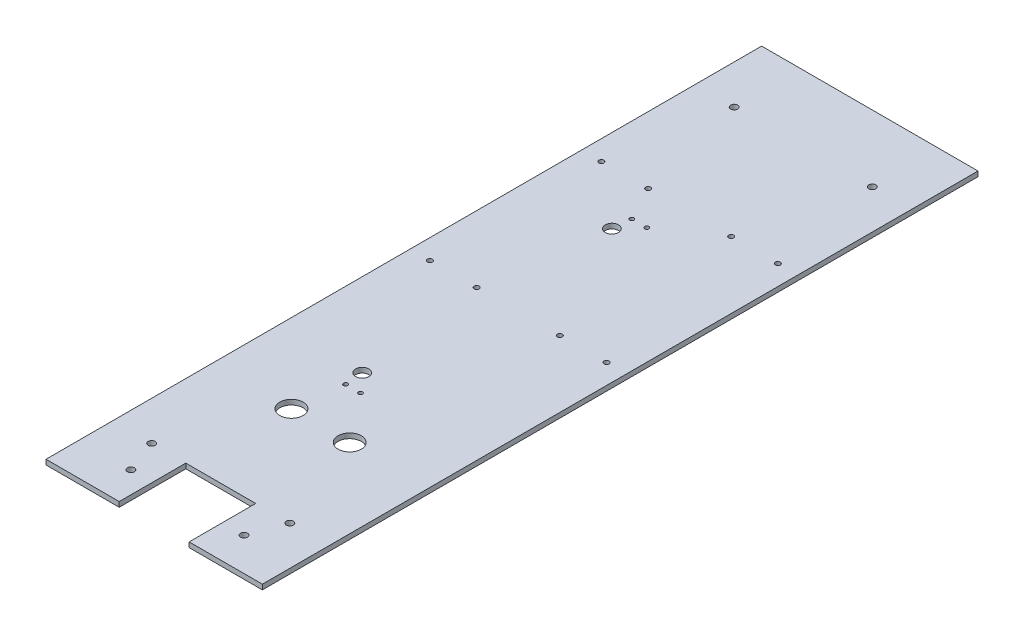
ISO-10303-21;
HEADER;
FILE_DESCRIPTION(('STEP AP214'),'2;1');
FILE_NAME('part.step','',(''),(''),'','','');
FILE_SCHEMA(('AUTOMOTIVE_DESIGN { 1 0 10303 214 1 1 1 1 }'));
ENDSEC;
DATA;
#1=APPLICATION_CONTEXT('core data for automotive mechanical design processes');
#2=APPLICATION_PROTOCOL_DEFINITION('international standard','automotive_design',2000,#1);
#3=PRODUCT_CONTEXT('',#1,'mechanical');
#4=PRODUCT('Part','Part','',(#3));
#5=PRODUCT_RELATED_PRODUCT_CATEGORY('part','',(#4));
#6=PRODUCT_DEFINITION_FORMATION('','',#4);
#7=PRODUCT_DEFINITION_CONTEXT('part definition',#1,'design');
#8=PRODUCT_DEFINITION('design','',#6,#7);
#9=PRODUCT_DEFINITION_SHAPE('','',#8);
#10=(LENGTH_UNIT() NAMED_UNIT(*) SI_UNIT(.MILLI.,.METRE.));
#11=(NAMED_UNIT(*) PLANE_ANGLE_UNIT() SI_UNIT($,.RADIAN.));
#12=(NAMED_UNIT(*) SI_UNIT($,.STERADIAN.) SOLID_ANGLE_UNIT());
#13=UNCERTAINTY_MEASURE_WITH_UNIT(LENGTH_MEASURE(1.E-05),#10,'distance_accuracy_value','');
#14=(GEOMETRIC_REPRESENTATION_CONTEXT(3) GLOBAL_UNCERTAINTY_ASSIGNED_CONTEXT((#13)) GLOBAL_UNIT_ASSIGNED_CONTEXT((#10,
#11,#12)) REPRESENTATION_CONTEXT('',''));
#15=CARTESIAN_POINT('',(0.,0.,0.));
#16=DIRECTION('',(0.,0.,1.));
#17=DIRECTION('',(1.,0.,0.));
#18=AXIS2_PLACEMENT_3D('',#15,#16,#17);
#19=CARTESIAN_POINT('',(-65.,3.,215.));
#20=DIRECTION('',(0.,0.,-1.));
#21=DIRECTION('',(-1.,0.,0.));
#22=AXIS2_PLACEMENT_3D('',#19,#20,#21);
#23=PLANE('',#22);
#24=DIRECTION('',(0.,1.,0.));
#25=VECTOR('',#24,1.);
#26=CARTESIAN_POINT('',(-21.,-7.,215.));
#27=LINE('',#26,#25);
#28=CARTESIAN_POINT('',(-21.,0.,215.));
#29=VERTEX_POINT('',#28);
#30=CARTESIAN_POINT('',(-21.,3.,215.));
#31=VERTEX_POINT('',#30);
#32=EDGE_CURVE('E122',#29,#31,#27,.T.);
#33=ORIENTED_EDGE('',*,*,#32,.T.);
#34=DIRECTION('',(1.,0.,0.));
#35=VECTOR('',#34,1.);
#36=CARTESIAN_POINT('',(-65.,3.,215.));
#37=LINE('',#36,#35);
#38=CARTESIAN_POINT('',(-65.,3.,215.));
#39=VERTEX_POINT('',#38);
#40=EDGE_CURVE('E136',#39,#31,#37,.T.);
#41=ORIENTED_EDGE('',*,*,#40,.F.);
#42=DIRECTION('',(0.,-1.,0.));
#43=VECTOR('',#42,1.);
#44=CARTESIAN_POINT('',(-65.,3.,215.));
#45=LINE('',#44,#43);
#46=CARTESIAN_POINT('',(-65.,0.,215.));
#47=VERTEX_POINT('',#46);
#48=EDGE_CURVE('E147',#39,#47,#45,.T.);
#49=ORIENTED_EDGE('',*,*,#48,.T.);
#50=DIRECTION('',(1.,0.,0.));
#51=VECTOR('',#50,1.);
#52=CARTESIAN_POINT('',(-65.,0.,215.));
#53=LINE('',#52,#51);
#54=EDGE_CURVE('E138',#47,#29,#53,.T.);
#55=ORIENTED_EDGE('',*,*,#54,.T.);
#56=EDGE_LOOP('',(#33,#41,#49,#55));
#57=FACE_BOUND('',#56,.T.);
#58=ADVANCED_FACE('F45',(#57),#23,.F.);
#59=CARTESIAN_POINT('',(0.,3.,0.));
#60=DIRECTION('',(0.,1.,0.));
#61=DIRECTION('',(0.,0.,1.));
#62=AXIS2_PLACEMENT_3D('',#59,#60,#61);
#63=PLANE('',#62);
#64=CARTESIAN_POINT('',(-5.00000000000006,3.,86.0000000000001));
#65=DIRECTION('',(0.,1.,0.));
#66=DIRECTION('',(0.,0.,1.));
#67=AXIS2_PLACEMENT_3D('',#64,#65,#66);
#68=CIRCLE('',#67,1.25);
#69=CARTESIAN_POINT('',(-5.00000000000006,3.,87.2500000000001));
#70=VERTEX_POINT('',#69);
#71=EDGE_CURVE('E316',#70,#70,#68,.T.);
#72=ORIENTED_EDGE('',*,*,#71,.F.);
#73=EDGE_LOOP('',(#72));
#74=FACE_BOUND('',#73,.T.);
#75=CARTESIAN_POINT('',(-14.0000000000001,3.,86.0000000000001));
#76=DIRECTION('',(0.,1.,0.));
#77=DIRECTION('',(0.,0.,1.));
#78=AXIS2_PLACEMENT_3D('',#75,#76,#77);
#79=CIRCLE('',#78,1.25);
#80=CARTESIAN_POINT('',(-14.0000000000001,3.,87.2500000000001));
#81=VERTEX_POINT('',#80);
#82=EDGE_CURVE('E310',#81,#81,#79,.T.);
#83=ORIENTED_EDGE('',*,*,#82,.F.);
#84=EDGE_LOOP('',(#83));
#85=FACE_BOUND('',#84,.T.);
#86=CARTESIAN_POINT('',(-15.0000000000001,3.,75.0000000000001));
#87=DIRECTION('',(0.,1.,0.));
#88=DIRECTION('',(0.,0.,1.));
#89=AXIS2_PLACEMENT_3D('',#86,#87,#88);
#90=CIRCLE('',#89,4.);
#91=CARTESIAN_POINT('',(-15.0000000000001,3.,79.0000000000001));
#92=VERTEX_POINT('',#91);
#93=EDGE_CURVE('E304',#92,#92,#90,.T.);
#94=ORIENTED_EDGE('',*,*,#93,.F.);
#95=EDGE_LOOP('',(#94));
#96=FACE_BOUND('',#95,.T.);
#97=CARTESIAN_POINT('',(-5.00000000000006,3.,-85.9999999999999));
#98=DIRECTION('',(0.,1.,0.));
#99=DIRECTION('',(0.,0.,1.));
#100=AXIS2_PLACEMENT_3D('',#97,#98,#99);
#101=CIRCLE('',#100,1.25);
#102=CARTESIAN_POINT('',(-5.00000000000006,3.,-84.7499999999999));
#103=VERTEX_POINT('',#102);
#104=EDGE_CURVE('E298',#103,#103,#101,.T.);
#105=ORIENTED_EDGE('',*,*,#104,.F.);
#106=EDGE_LOOP('',(#105));
#107=FACE_BOUND('',#106,.T.);
#108=CARTESIAN_POINT('',(-14.0000000000001,3.,-85.9999999999999));
#109=DIRECTION('',(0.,1.,0.));
#110=DIRECTION('',(0.,0.,1.));
#111=AXIS2_PLACEMENT_3D('',#108,#109,#110);
#112=CIRCLE('',#111,1.25);
#113=CARTESIAN_POINT('',(-14.0000000000001,3.,-84.7499999999999));
#114=VERTEX_POINT('',#113);
#115=EDGE_CURVE('E292',#114,#114,#112,.T.);
#116=ORIENTED_EDGE('',*,*,#115,.F.);
#117=EDGE_LOOP('',(#116));
#118=FACE_BOUND('',#117,.T.);
#119=CARTESIAN_POINT('',(-15.0000000000001,3.,-74.9999999999999));
#120=DIRECTION('',(0.,1.,0.));
#121=DIRECTION('',(0.,0.,1.));
#122=AXIS2_PLACEMENT_3D('',#119,#120,#121);
#123=CIRCLE('',#122,4.);
#124=CARTESIAN_POINT('',(-15.0000000000001,3.,-70.9999999999999));
#125=VERTEX_POINT('',#124);
#126=EDGE_CURVE('E286',#125,#125,#123,.T.);
#127=ORIENTED_EDGE('',*,*,#126,.F.);
#128=EDGE_LOOP('',(#127));
#129=FACE_BOUND('',#128,.T.);
#130=CARTESIAN_POINT('',(17.4999999999999,3.,115.));
#131=DIRECTION('',(0.,1.,0.));
#132=DIRECTION('',(0.,0.,1.));
#133=AXIS2_PLACEMENT_3D('',#130,#131,#132);
#134=CIRCLE('',#133,7.);
#135=CARTESIAN_POINT('',(17.4999999999999,3.,122.));
#136=VERTEX_POINT('',#135);
#137=EDGE_CURVE('E280',#136,#136,#134,.T.);
#138=ORIENTED_EDGE('',*,*,#137,.F.);
#139=EDGE_LOOP('',(#138));
#140=FACE_BOUND('',#139,.T.);
#141=CARTESIAN_POINT('',(-17.5000000000001,3.,115.));
#142=DIRECTION('',(0.,1.,0.));
#143=DIRECTION('',(0.,0.,1.));
#144=AXIS2_PLACEMENT_3D('',#141,#142,#143);
#145=CIRCLE('',#144,7.);
#146=CARTESIAN_POINT('',(-17.5000000000001,3.,122.));
#147=VERTEX_POINT('',#146);
#148=EDGE_CURVE('E274',#147,#147,#145,.T.);
#149=ORIENTED_EDGE('',*,*,#148,.F.);
#150=EDGE_LOOP('',(#149));
#151=FACE_BOUND('',#150,.T.);
#152=CARTESIAN_POINT('',(-41.5000000000001,3.,-175.));
#153=DIRECTION('',(0.,1.,0.));
#154=DIRECTION('',(0.,0.,1.));
#155=AXIS2_PLACEMENT_3D('',#152,#153,#154);
#156=CIRCLE('',#155,2.09999999999999);
#157=CARTESIAN_POINT('',(-41.5000000000001,3.,-172.9));
#158=VERTEX_POINT('',#157);
#159=EDGE_CURVE('E268',#158,#158,#156,.T.);
#160=ORIENTED_EDGE('',*,*,#159,.F.);
#161=EDGE_LOOP('',(#160));
#162=FACE_BOUND('',#161,.T.);
#163=CARTESIAN_POINT('',(41.4999999999999,3.,-175.));
#164=DIRECTION('',(0.,1.,0.));
#165=DIRECTION('',(0.,0.,1.));
#166=AXIS2_PLACEMENT_3D('',#163,#164,#165);
#167=CIRCLE('',#166,2.09999999999999);
#168=CARTESIAN_POINT('',(41.4999999999999,3.,-172.9));
#169=VERTEX_POINT('',#168);
#170=EDGE_CURVE('E262',#169,#169,#167,.T.);
#171=ORIENTED_EDGE('',*,*,#170,.F.);
#172=EDGE_LOOP('',(#171));
#173=FACE_BOUND('',#172,.T.);
#174=CARTESIAN_POINT('',(41.5,3.,175.));
#175=DIRECTION('',(0.,1.,0.));
#176=DIRECTION('',(0.,0.,1.));
#177=AXIS2_PLACEMENT_3D('',#174,#175,#176);
#178=CIRCLE('',#177,2.09999999999999);
#179=CARTESIAN_POINT('',(41.5,3.,177.1));
#180=VERTEX_POINT('',#179);
#181=EDGE_CURVE('E256',#180,#180,#178,.T.);
#182=ORIENTED_EDGE('',*,*,#181,.F.);
#183=EDGE_LOOP('',(#182));
#184=FACE_BOUND('',#183,.T.);
#185=CARTESIAN_POINT('',(-41.5,3.,175.));
#186=DIRECTION('',(0.,1.,0.));
#187=DIRECTION('',(0.,0.,1.));
#188=AXIS2_PLACEMENT_3D('',#185,#186,#187);
#189=CIRCLE('',#188,2.09999999999999);
#190=CARTESIAN_POINT('',(-41.5,3.,177.1));
#191=VERTEX_POINT('',#190);
#192=EDGE_CURVE('E250',#191,#191,#189,.T.);
#193=ORIENTED_EDGE('',*,*,#192,.F.);
#194=EDGE_LOOP('',(#193));
#195=FACE_BOUND('',#194,.T.);
#196=CARTESIAN_POINT('',(53.05,3.,-3.75000000000119));
#197=DIRECTION('',(0.,1.,0.));
#198=DIRECTION('',(0.,0.,1.));
#199=AXIS2_PLACEMENT_3D('',#196,#197,#198);
#200=CIRCLE('',#199,1.5);
#201=CARTESIAN_POINT('',(53.05,3.,-2.25000000000118));
#202=VERTEX_POINT('',#201);
#203=EDGE_CURVE('E244',#202,#202,#200,.T.);
#204=ORIENTED_EDGE('',*,*,#203,.F.);
#205=EDGE_LOOP('',(#204));
#206=FACE_BOUND('',#205,.T.);
#207=CARTESIAN_POINT('',(-34.0000000000001,3.,195.));
#208=DIRECTION('',(0.,1.,0.));
#209=DIRECTION('',(0.,0.,1.));
#210=AXIS2_PLACEMENT_3D('',#207,#208,#209);
#211=CIRCLE('',#210,2.09999999999999);
#212=CARTESIAN_POINT('',(-34.0000000000001,3.,197.1));
#213=VERTEX_POINT('',#212);
#214=EDGE_CURVE('E238',#213,#213,#211,.T.);
#215=ORIENTED_EDGE('',*,*,#214,.F.);
#216=EDGE_LOOP('',(#215));
#217=FACE_BOUND('',#216,.T.);
#218=CARTESIAN_POINT('',(24.9500000000001,3.,-3.75000000000119));
#219=DIRECTION('',(0.,1.,0.));
#220=DIRECTION('',(0.,0.,1.));
#221=AXIS2_PLACEMENT_3D('',#218,#219,#220);
#222=CIRCLE('',#221,1.5);
#223=CARTESIAN_POINT('',(24.9500000000001,3.,-2.25000000000119));
#224=VERTEX_POINT('',#223);
#225=EDGE_CURVE('E232',#224,#224,#222,.T.);
#226=ORIENTED_EDGE('',*,*,#225,.F.);
#227=EDGE_LOOP('',(#226));
#228=FACE_BOUND('',#227,.T.);
#229=CARTESIAN_POINT('',(53.05,3.,-106.75));
#230=DIRECTION('',(0.,1.,0.));
#231=DIRECTION('',(0.,0.,1.));
#232=AXIS2_PLACEMENT_3D('',#229,#230,#231);
#233=CIRCLE('',#232,1.5);
#234=CARTESIAN_POINT('',(53.05,3.,-105.25));
#235=VERTEX_POINT('',#234);
#236=EDGE_CURVE('E226',#235,#235,#233,.T.);
#237=ORIENTED_EDGE('',*,*,#236,.F.);
#238=EDGE_LOOP('',(#237));
#239=FACE_BOUND('',#238,.T.);
#240=CARTESIAN_POINT('',(34.,3.,195.));
#241=DIRECTION('',(0.,1.,0.));
#242=DIRECTION('',(0.,0.,1.));
#243=AXIS2_PLACEMENT_3D('',#240,#241,#242);
#244=CIRCLE('',#243,2.09999999999999);
#245=CARTESIAN_POINT('',(34.,3.,197.1));
#246=VERTEX_POINT('',#245);
#247=EDGE_CURVE('E220',#246,#246,#244,.T.);
#248=ORIENTED_EDGE('',*,*,#247,.F.);
#249=EDGE_LOOP('',(#248));
#250=FACE_BOUND('',#249,.T.);
#251=CARTESIAN_POINT('',(24.95,3.,-106.75));
#252=DIRECTION('',(0.,1.,0.));
#253=DIRECTION('',(0.,0.,1.));
#254=AXIS2_PLACEMENT_3D('',#251,#252,#253);
#255=CIRCLE('',#254,1.5);
#256=CARTESIAN_POINT('',(24.95,3.,-105.25));
#257=VERTEX_POINT('',#256);
#258=EDGE_CURVE('E214',#257,#257,#255,.T.);
#259=ORIENTED_EDGE('',*,*,#258,.F.);
#260=EDGE_LOOP('',(#259));
#261=FACE_BOUND('',#260,.T.);
#262=CARTESIAN_POINT('',(-24.95,3.,-106.75));
#263=DIRECTION('',(0.,1.,0.));
#264=DIRECTION('',(0.,0.,1.));
#265=AXIS2_PLACEMENT_3D('',#262,#263,#264);
#266=CIRCLE('',#265,1.5);
#267=CARTESIAN_POINT('',(-24.95,3.,-105.25));
#268=VERTEX_POINT('',#267);
#269=EDGE_CURVE('E208',#268,#268,#266,.T.);
#270=ORIENTED_EDGE('',*,*,#269,.F.);
#271=EDGE_LOOP('',(#270));
#272=FACE_BOUND('',#271,.T.);
#273=CARTESIAN_POINT('',(-53.05,3.,-106.75));
#274=DIRECTION('',(0.,1.,0.));
#275=DIRECTION('',(0.,0.,1.));
#276=AXIS2_PLACEMENT_3D('',#273,#274,#275);
#277=CIRCLE('',#276,1.5);
#278=CARTESIAN_POINT('',(-53.05,3.,-105.25));
#279=VERTEX_POINT('',#278);
#280=EDGE_CURVE('E202',#279,#279,#277,.T.);
#281=ORIENTED_EDGE('',*,*,#280,.F.);
#282=EDGE_LOOP('',(#281));
#283=FACE_BOUND('',#282,.T.);
#284=CARTESIAN_POINT('',(-24.9500000000001,3.,-3.75000000000119));
#285=DIRECTION('',(0.,1.,0.));
#286=DIRECTION('',(0.,0.,1.));
#287=AXIS2_PLACEMENT_3D('',#284,#285,#286);
#288=CIRCLE('',#287,1.5);
#289=CARTESIAN_POINT('',(-24.9500000000001,3.,-2.25000000000119));
#290=VERTEX_POINT('',#289);
#291=EDGE_CURVE('E196',#290,#290,#288,.T.);
#292=ORIENTED_EDGE('',*,*,#291,.F.);
#293=EDGE_LOOP('',(#292));
#294=FACE_BOUND('',#293,.T.);
#295=CARTESIAN_POINT('',(-53.05,3.,-3.75000000000119));
#296=DIRECTION('',(0.,1.,0.));
#297=DIRECTION('',(0.,0.,1.));
#298=AXIS2_PLACEMENT_3D('',#295,#296,#297);
#299=CIRCLE('',#298,1.5);
#300=CARTESIAN_POINT('',(-53.05,3.,-2.25000000000118));
#301=VERTEX_POINT('',#300);
#302=EDGE_CURVE('E130',#301,#301,#299,.T.);
#303=ORIENTED_EDGE('',*,*,#302,.F.);
#304=EDGE_LOOP('',(#303));
#305=FACE_BOUND('',#304,.T.);
#306=ORIENTED_EDGE('',*,*,#40,.T.);
#307=DIRECTION('',(0.,0.,-1.));
#308=VECTOR('',#307,1.);
#309=CARTESIAN_POINT('',(-21.,3.,215.));
#310=LINE('',#309,#308);
#311=CARTESIAN_POINT('',(-21.,3.,175.));
#312=VERTEX_POINT('',#311);
#313=EDGE_CURVE('E119',#31,#312,#310,.T.);
#314=ORIENTED_EDGE('',*,*,#313,.T.);
#315=DIRECTION('',(-1.,0.,0.));
#316=VECTOR('',#315,1.);
#317=CARTESIAN_POINT('',(21.,3.,175.));
#318=LINE('',#317,#316);
#319=CARTESIAN_POINT('',(21.,3.,175.));
#320=VERTEX_POINT('',#319);
#321=EDGE_CURVE('E129',#320,#312,#318,.T.);
#322=ORIENTED_EDGE('',*,*,#321,.F.);
#323=DIRECTION('',(0.,0.,-1.));
#324=VECTOR('',#323,1.);
#325=CARTESIAN_POINT('',(21.,3.,215.));
#326=LINE('',#325,#324);
#327=CARTESIAN_POINT('',(21.,3.,215.));
#328=VERTEX_POINT('',#327);
#329=EDGE_CURVE('E187',#328,#320,#326,.T.);
#330=ORIENTED_EDGE('',*,*,#329,.F.);
#331=CARTESIAN_POINT('',(65.,3.,215.));
#332=VERTEX_POINT('',#331);
#333=EDGE_CURVE('E69',#328,#332,#37,.T.);
#334=ORIENTED_EDGE('',*,*,#333,.T.);
#335=DIRECTION('',(0.,0.,-1.));
#336=VECTOR('',#335,1.);
#337=CARTESIAN_POINT('',(64.9999999999999,3.,-215.));
#338=LINE('',#337,#336);
#339=CARTESIAN_POINT('',(64.9999999999999,3.,-215.));
#340=VERTEX_POINT('',#339);
#341=EDGE_CURVE('E158',#332,#340,#338,.T.);
#342=ORIENTED_EDGE('',*,*,#341,.T.);
#343=DIRECTION('',(-1.,0.,0.));
#344=VECTOR('',#343,1.);
#345=CARTESIAN_POINT('',(-65.0000000000001,3.,-215.));
#346=LINE('',#345,#344);
#347=CARTESIAN_POINT('',(-65.0000000000001,3.,-215.));
#348=VERTEX_POINT('',#347);
#349=EDGE_CURVE('E99',#340,#348,#346,.T.);
#350=ORIENTED_EDGE('',*,*,#349,.T.);
#351=DIRECTION('',(0.,0.,1.));
#352=VECTOR('',#351,1.);
#353=CARTESIAN_POINT('',(-65.0000000000001,3.,-215.));
#354=LINE('',#353,#352);
#355=EDGE_CURVE('E143',#348,#39,#354,.T.);
#356=ORIENTED_EDGE('',*,*,#355,.T.);
#357=EDGE_LOOP('',(#306,#314,#322,#330,#334,#342,#350,#356));
#358=FACE_BOUND('',#357,.T.);
#359=ADVANCED_FACE('F141',(#74,#85,#96,#107,#118,#129,#140,#151,#162,#173,#184,#195,#206,#217,
#228,#239,#250,#261,#272,#283,#294,#305,#358),#63,.T.);
#360=CARTESIAN_POINT('',(0.,0.,0.));
#361=DIRECTION('',(0.,1.,0.));
#362=DIRECTION('',(0.,0.,1.));
#363=AXIS2_PLACEMENT_3D('',#360,#361,#362);
#364=PLANE('',#363);
#365=CARTESIAN_POINT('',(-5.00000000000006,0.,86.0000000000001));
#366=DIRECTION('',(0.,-1.,0.));
#367=DIRECTION('',(0.,0.,1.));
#368=AXIS2_PLACEMENT_3D('',#365,#366,#367);
#369=CIRCLE('',#368,1.25);
#370=CARTESIAN_POINT('',(-5.00000000000006,0.,87.2500000000001));
#371=VERTEX_POINT('',#370);
#372=EDGE_CURVE('E319',#371,#371,#369,.T.);
#373=ORIENTED_EDGE('',*,*,#372,.F.);
#374=EDGE_LOOP('',(#373));
#375=FACE_BOUND('',#374,.T.);
#376=CARTESIAN_POINT('',(-14.0000000000001,0.,86.0000000000001));
#377=DIRECTION('',(0.,-1.,0.));
#378=DIRECTION('',(0.,0.,1.));
#379=AXIS2_PLACEMENT_3D('',#376,#377,#378);
#380=CIRCLE('',#379,1.25);
#381=CARTESIAN_POINT('',(-14.0000000000001,0.,87.2500000000001));
#382=VERTEX_POINT('',#381);
#383=EDGE_CURVE('E313',#382,#382,#380,.T.);
#384=ORIENTED_EDGE('',*,*,#383,.F.);
#385=EDGE_LOOP('',(#384));
#386=FACE_BOUND('',#385,.T.);
#387=CARTESIAN_POINT('',(-15.0000000000001,0.,75.0000000000001));
#388=DIRECTION('',(0.,-1.,0.));
#389=DIRECTION('',(0.,0.,1.));
#390=AXIS2_PLACEMENT_3D('',#387,#388,#389);
#391=CIRCLE('',#390,4.);
#392=CARTESIAN_POINT('',(-15.0000000000001,0.,79.0000000000001));
#393=VERTEX_POINT('',#392);
#394=EDGE_CURVE('E307',#393,#393,#391,.T.);
#395=ORIENTED_EDGE('',*,*,#394,.F.);
#396=EDGE_LOOP('',(#395));
#397=FACE_BOUND('',#396,.T.);
#398=CARTESIAN_POINT('',(-5.00000000000006,0.,-85.9999999999999));
#399=DIRECTION('',(0.,-1.,0.));
#400=DIRECTION('',(0.,0.,-1.));
#401=AXIS2_PLACEMENT_3D('',#398,#399,#400);
#402=CIRCLE('',#401,1.25);
#403=CARTESIAN_POINT('',(-5.00000000000006,0.,-87.2499999999999));
#404=VERTEX_POINT('',#403);
#405=EDGE_CURVE('E301',#404,#404,#402,.T.);
#406=ORIENTED_EDGE('',*,*,#405,.F.);
#407=EDGE_LOOP('',(#406));
#408=FACE_BOUND('',#407,.T.);
#409=CARTESIAN_POINT('',(-14.0000000000001,0.,-85.9999999999999));
#410=DIRECTION('',(0.,-1.,0.));
#411=DIRECTION('',(0.,0.,-1.));
#412=AXIS2_PLACEMENT_3D('',#409,#410,#411);
#413=CIRCLE('',#412,1.25);
#414=CARTESIAN_POINT('',(-14.0000000000001,0.,-87.2499999999999));
#415=VERTEX_POINT('',#414);
#416=EDGE_CURVE('E295',#415,#415,#413,.T.);
#417=ORIENTED_EDGE('',*,*,#416,.F.);
#418=EDGE_LOOP('',(#417));
#419=FACE_BOUND('',#418,.T.);
#420=CARTESIAN_POINT('',(-15.0000000000001,0.,-74.9999999999999));
#421=DIRECTION('',(0.,-1.,0.));
#422=DIRECTION('',(0.,0.,-1.));
#423=AXIS2_PLACEMENT_3D('',#420,#421,#422);
#424=CIRCLE('',#423,4.);
#425=CARTESIAN_POINT('',(-15.0000000000001,0.,-78.9999999999999));
#426=VERTEX_POINT('',#425);
#427=EDGE_CURVE('E289',#426,#426,#424,.T.);
#428=ORIENTED_EDGE('',*,*,#427,.F.);
#429=EDGE_LOOP('',(#428));
#430=FACE_BOUND('',#429,.T.);
#431=CARTESIAN_POINT('',(17.4999999999999,0.,115.));
#432=DIRECTION('',(0.,-1.,0.));
#433=DIRECTION('',(0.,0.,-1.));
#434=AXIS2_PLACEMENT_3D('',#431,#432,#433);
#435=CIRCLE('',#434,7.);
#436=CARTESIAN_POINT('',(17.4999999999999,0.,108.));
#437=VERTEX_POINT('',#436);
#438=EDGE_CURVE('E283',#437,#437,#435,.T.);
#439=ORIENTED_EDGE('',*,*,#438,.F.);
#440=EDGE_LOOP('',(#439));
#441=FACE_BOUND('',#440,.T.);
#442=CARTESIAN_POINT('',(-17.5000000000001,0.,115.));
#443=DIRECTION('',(0.,-1.,0.));
#444=DIRECTION('',(0.,0.,-1.));
#445=AXIS2_PLACEMENT_3D('',#442,#443,#444);
#446=CIRCLE('',#445,7.);
#447=CARTESIAN_POINT('',(-17.5000000000001,0.,108.));
#448=VERTEX_POINT('',#447);
#449=EDGE_CURVE('E277',#448,#448,#446,.T.);
#450=ORIENTED_EDGE('',*,*,#449,.F.);
#451=EDGE_LOOP('',(#450));
#452=FACE_BOUND('',#451,.T.);
#453=CARTESIAN_POINT('',(-41.5000000000001,0.,-175.));
#454=DIRECTION('',(0.,-1.,0.));
#455=DIRECTION('',(0.,0.,-1.));
#456=AXIS2_PLACEMENT_3D('',#453,#454,#455);
#457=CIRCLE('',#456,2.09999999999999);
#458=CARTESIAN_POINT('',(-41.5000000000001,0.,-177.1));
#459=VERTEX_POINT('',#458);
#460=EDGE_CURVE('E271',#459,#459,#457,.T.);
#461=ORIENTED_EDGE('',*,*,#460,.F.);
#462=EDGE_LOOP('',(#461));
#463=FACE_BOUND('',#462,.T.);
#464=CARTESIAN_POINT('',(41.4999999999999,0.,-175.));
#465=DIRECTION('',(0.,-1.,0.));
#466=DIRECTION('',(0.,0.,-1.));
#467=AXIS2_PLACEMENT_3D('',#464,#465,#466);
#468=CIRCLE('',#467,2.09999999999999);
#469=CARTESIAN_POINT('',(41.4999999999999,0.,-177.1));
#470=VERTEX_POINT('',#469);
#471=EDGE_CURVE('E265',#470,#470,#468,.T.);
#472=ORIENTED_EDGE('',*,*,#471,.F.);
#473=EDGE_LOOP('',(#472));
#474=FACE_BOUND('',#473,.T.);
#475=CARTESIAN_POINT('',(41.5,0.,175.));
#476=DIRECTION('',(0.,-1.,0.));
#477=DIRECTION('',(0.,0.,-1.));
#478=AXIS2_PLACEMENT_3D('',#475,#476,#477);
#479=CIRCLE('',#478,2.09999999999999);
#480=CARTESIAN_POINT('',(41.5,0.,172.9));
#481=VERTEX_POINT('',#480);
#482=EDGE_CURVE('E259',#481,#481,#479,.T.);
#483=ORIENTED_EDGE('',*,*,#482,.F.);
#484=EDGE_LOOP('',(#483));
#485=FACE_BOUND('',#484,.T.);
#486=CARTESIAN_POINT('',(-41.5,0.,175.));
#487=DIRECTION('',(0.,-1.,0.));
#488=DIRECTION('',(0.,0.,-1.));
#489=AXIS2_PLACEMENT_3D('',#486,#487,#488);
#490=CIRCLE('',#489,2.09999999999999);
#491=CARTESIAN_POINT('',(-41.5,0.,172.9));
#492=VERTEX_POINT('',#491);
#493=EDGE_CURVE('E253',#492,#492,#490,.T.);
#494=ORIENTED_EDGE('',*,*,#493,.F.);
#495=EDGE_LOOP('',(#494));
#496=FACE_BOUND('',#495,.T.);
#497=CARTESIAN_POINT('',(53.05,0.,-3.75000000000119));
#498=DIRECTION('',(0.,-1.,0.));
#499=DIRECTION('',(0.,0.,1.));
#500=AXIS2_PLACEMENT_3D('',#497,#498,#499);
#501=CIRCLE('',#500,1.5);
#502=CARTESIAN_POINT('',(53.05,0.,-2.25000000000118));
#503=VERTEX_POINT('',#502);
#504=EDGE_CURVE('E247',#503,#503,#501,.T.);
#505=ORIENTED_EDGE('',*,*,#504,.F.);
#506=EDGE_LOOP('',(#505));
#507=FACE_BOUND('',#506,.T.);
#508=CARTESIAN_POINT('',(-34.0000000000001,0.,195.));
#509=DIRECTION('',(0.,-1.,0.));
#510=DIRECTION('',(0.,0.,-1.));
#511=AXIS2_PLACEMENT_3D('',#508,#509,#510);
#512=CIRCLE('',#511,2.09999999999999);
#513=CARTESIAN_POINT('',(-34.0000000000001,0.,192.9));
#514=VERTEX_POINT('',#513);
#515=EDGE_CURVE('E241',#514,#514,#512,.T.);
#516=ORIENTED_EDGE('',*,*,#515,.F.);
#517=EDGE_LOOP('',(#516));
#518=FACE_BOUND('',#517,.T.);
#519=CARTESIAN_POINT('',(24.9500000000001,0.,-3.75000000000119));
#520=DIRECTION('',(0.,-1.,0.));
#521=DIRECTION('',(0.,0.,1.));
#522=AXIS2_PLACEMENT_3D('',#519,#520,#521);
#523=CIRCLE('',#522,1.5);
#524=CARTESIAN_POINT('',(24.9500000000001,0.,-2.25000000000119));
#525=VERTEX_POINT('',#524);
#526=EDGE_CURVE('E235',#525,#525,#523,.T.);
#527=ORIENTED_EDGE('',*,*,#526,.F.);
#528=EDGE_LOOP('',(#527));
#529=FACE_BOUND('',#528,.T.);
#530=CARTESIAN_POINT('',(53.05,0.,-106.75));
#531=DIRECTION('',(0.,-1.,0.));
#532=DIRECTION('',(0.,0.,1.));
#533=AXIS2_PLACEMENT_3D('',#530,#531,#532);
#534=CIRCLE('',#533,1.5);
#535=CARTESIAN_POINT('',(53.05,0.,-105.25));
#536=VERTEX_POINT('',#535);
#537=EDGE_CURVE('E229',#536,#536,#534,.T.);
#538=ORIENTED_EDGE('',*,*,#537,.F.);
#539=EDGE_LOOP('',(#538));
#540=FACE_BOUND('',#539,.T.);
#541=CARTESIAN_POINT('',(34.,0.,195.));
#542=DIRECTION('',(0.,-1.,0.));
#543=DIRECTION('',(0.,0.,-1.));
#544=AXIS2_PLACEMENT_3D('',#541,#542,#543);
#545=CIRCLE('',#544,2.09999999999999);
#546=CARTESIAN_POINT('',(34.,0.,192.9));
#547=VERTEX_POINT('',#546);
#548=EDGE_CURVE('E223',#547,#547,#545,.T.);
#549=ORIENTED_EDGE('',*,*,#548,.F.);
#550=EDGE_LOOP('',(#549));
#551=FACE_BOUND('',#550,.T.);
#552=CARTESIAN_POINT('',(24.95,0.,-106.75));
#553=DIRECTION('',(0.,-1.,0.));
#554=DIRECTION('',(0.,0.,1.));
#555=AXIS2_PLACEMENT_3D('',#552,#553,#554);
#556=CIRCLE('',#555,1.5);
#557=CARTESIAN_POINT('',(24.95,0.,-105.25));
#558=VERTEX_POINT('',#557);
#559=EDGE_CURVE('E217',#558,#558,#556,.T.);
#560=ORIENTED_EDGE('',*,*,#559,.F.);
#561=EDGE_LOOP('',(#560));
#562=FACE_BOUND('',#561,.T.);
#563=CARTESIAN_POINT('',(-24.95,0.,-106.75));
#564=DIRECTION('',(0.,-1.,0.));
#565=DIRECTION('',(0.,0.,-1.));
#566=AXIS2_PLACEMENT_3D('',#563,#564,#565);
#567=CIRCLE('',#566,1.5);
#568=CARTESIAN_POINT('',(-24.95,0.,-108.25));
#569=VERTEX_POINT('',#568);
#570=EDGE_CURVE('E211',#569,#569,#567,.T.);
#571=ORIENTED_EDGE('',*,*,#570,.F.);
#572=EDGE_LOOP('',(#571));
#573=FACE_BOUND('',#572,.T.);
#574=CARTESIAN_POINT('',(-53.05,0.,-106.75));
#575=DIRECTION('',(0.,-1.,0.));
#576=DIRECTION('',(0.,0.,-1.));
#577=AXIS2_PLACEMENT_3D('',#574,#575,#576);
#578=CIRCLE('',#577,1.5);
#579=CARTESIAN_POINT('',(-53.05,0.,-108.25));
#580=VERTEX_POINT('',#579);
#581=EDGE_CURVE('E205',#580,#580,#578,.T.);
#582=ORIENTED_EDGE('',*,*,#581,.F.);
#583=EDGE_LOOP('',(#582));
#584=FACE_BOUND('',#583,.T.);
#585=CARTESIAN_POINT('',(-24.9500000000001,0.,-3.75000000000119));
#586=DIRECTION('',(0.,-1.,0.));
#587=DIRECTION('',(0.,0.,-1.));
#588=AXIS2_PLACEMENT_3D('',#585,#586,#587);
#589=CIRCLE('',#588,1.5);
#590=CARTESIAN_POINT('',(-24.9500000000001,0.,-5.25000000000119));
#591=VERTEX_POINT('',#590);
#592=EDGE_CURVE('E199',#591,#591,#589,.T.);
#593=ORIENTED_EDGE('',*,*,#592,.F.);
#594=EDGE_LOOP('',(#593));
#595=FACE_BOUND('',#594,.T.);
#596=CARTESIAN_POINT('',(-53.05,0.,-3.75000000000119));
#597=DIRECTION('',(0.,-1.,0.));
#598=DIRECTION('',(0.,0.,-1.));
#599=AXIS2_PLACEMENT_3D('',#596,#597,#598);
#600=CIRCLE('',#599,1.5);
#601=CARTESIAN_POINT('',(-53.05,0.,-5.25000000000119));
#602=VERTEX_POINT('',#601);
#603=EDGE_CURVE('E193',#602,#602,#600,.T.);
#604=ORIENTED_EDGE('',*,*,#603,.F.);
#605=EDGE_LOOP('',(#604));
#606=FACE_BOUND('',#605,.T.);
#607=DIRECTION('',(0.,0.,-1.));
#608=VECTOR('',#607,1.);
#609=CARTESIAN_POINT('',(-21.,0.,0.));
#610=LINE('',#609,#608);
#611=CARTESIAN_POINT('',(-21.,0.,175.));
#612=VERTEX_POINT('',#611);
#613=EDGE_CURVE('E13',#29,#612,#610,.T.);
#614=ORIENTED_EDGE('',*,*,#613,.F.);
#615=ORIENTED_EDGE('',*,*,#54,.F.);
#616=DIRECTION('',(0.,0.,1.));
#617=VECTOR('',#616,1.);
#618=CARTESIAN_POINT('',(-65.0000000000001,0.,-215.));
#619=LINE('',#618,#617);
#620=CARTESIAN_POINT('',(-65.0000000000001,0.,-215.));
#621=VERTEX_POINT('',#620);
#622=EDGE_CURVE('E156',#621,#47,#619,.T.);
#623=ORIENTED_EDGE('',*,*,#622,.F.);
#624=DIRECTION('',(-1.,0.,0.));
#625=VECTOR('',#624,1.);
#626=CARTESIAN_POINT('',(-65.0000000000001,0.,-215.));
#627=LINE('',#626,#625);
#628=CARTESIAN_POINT('',(64.9999999999999,0.,-215.));
#629=VERTEX_POINT('',#628);
#630=EDGE_CURVE('E154',#629,#621,#627,.T.);
#631=ORIENTED_EDGE('',*,*,#630,.F.);
#632=DIRECTION('',(0.,0.,-1.));
#633=VECTOR('',#632,1.);
#634=CARTESIAN_POINT('',(64.9999999999999,0.,-215.));
#635=LINE('',#634,#633);
#636=CARTESIAN_POINT('',(65.,0.,215.));
#637=VERTEX_POINT('',#636);
#638=EDGE_CURVE('E139',#637,#629,#635,.T.);
#639=ORIENTED_EDGE('',*,*,#638,.F.);
#640=CARTESIAN_POINT('',(21.,0.,215.));
#641=VERTEX_POINT('',#640);
#642=EDGE_CURVE('E91',#641,#637,#53,.T.);
#643=ORIENTED_EDGE('',*,*,#642,.F.);
#644=DIRECTION('',(0.,0.,-1.));
#645=VECTOR('',#644,1.);
#646=CARTESIAN_POINT('',(21.,0.,0.));
#647=LINE('',#646,#645);
#648=CARTESIAN_POINT('',(21.,0.,175.));
#649=VERTEX_POINT('',#648);
#650=EDGE_CURVE('E166',#641,#649,#647,.T.);
#651=ORIENTED_EDGE('',*,*,#650,.T.);
#652=DIRECTION('',(-1.,0.,0.));
#653=VECTOR('',#652,1.);
#654=CARTESIAN_POINT('',(0.,0.,175.));
#655=LINE('',#654,#653);
#656=EDGE_CURVE('E53',#649,#612,#655,.T.);
#657=ORIENTED_EDGE('',*,*,#656,.T.);
#658=EDGE_LOOP('',(#614,#615,#623,#631,#639,#643,#651,#657));
#659=FACE_BOUND('',#658,.T.);
#660=ADVANCED_FACE('F170',(#375,#386,#397,#408,#419,#430,#441,#452,#463,#474,#485,#496,#507,
#518,#529,#540,#551,#562,#573,#584,#595,#606,#659),#364,.F.);
#661=CARTESIAN_POINT('',(64.9999999999999,3.,-215.));
#662=DIRECTION('',(-1.,0.,0.));
#663=DIRECTION('',(0.,0.,1.));
#664=AXIS2_PLACEMENT_3D('',#661,#662,#663);
#665=PLANE('',#664);
#666=ORIENTED_EDGE('',*,*,#638,.T.);
#667=DIRECTION('',(0.,-1.,0.));
#668=VECTOR('',#667,1.);
#669=CARTESIAN_POINT('',(64.9999999999999,3.,-215.));
#670=LINE('',#669,#668);
#671=EDGE_CURVE('E164',#340,#629,#670,.T.);
#672=ORIENTED_EDGE('',*,*,#671,.F.);
#673=ORIENTED_EDGE('',*,*,#341,.F.);
#674=DIRECTION('',(0.,-1.,0.));
#675=VECTOR('',#674,1.);
#676=CARTESIAN_POINT('',(65.,3.,215.));
#677=LINE('',#676,#675);
#678=EDGE_CURVE('E145',#332,#637,#677,.T.);
#679=ORIENTED_EDGE('',*,*,#678,.T.);
#680=EDGE_LOOP('',(#666,#672,#673,#679));
#681=FACE_BOUND('',#680,.T.);
#682=ADVANCED_FACE('F47',(#681),#665,.F.);
#683=CARTESIAN_POINT('',(-65.0000000000001,3.,-215.));
#684=DIRECTION('',(0.,0.,1.));
#685=DIRECTION('',(1.,0.,0.));
#686=AXIS2_PLACEMENT_3D('',#683,#684,#685);
#687=PLANE('',#686);
#688=ORIENTED_EDGE('',*,*,#630,.T.);
#689=DIRECTION('',(0.,-1.,0.));
#690=VECTOR('',#689,1.);
#691=CARTESIAN_POINT('',(-65.0000000000001,3.,-215.));
#692=LINE('',#691,#690);
#693=EDGE_CURVE('E161',#348,#621,#692,.T.);
#694=ORIENTED_EDGE('',*,*,#693,.F.);
#695=ORIENTED_EDGE('',*,*,#349,.F.);
#696=ORIENTED_EDGE('',*,*,#671,.T.);
#697=EDGE_LOOP('',(#688,#694,#695,#696));
#698=FACE_BOUND('',#697,.T.);
#699=ADVANCED_FACE('F180',(#698),#687,.F.);
#700=CARTESIAN_POINT('',(-65.0000000000001,3.,-215.));
#701=DIRECTION('',(1.,0.,0.));
#702=DIRECTION('',(0.,0.,-1.));
#703=AXIS2_PLACEMENT_3D('',#700,#701,#702);
#704=PLANE('',#703);
#705=ORIENTED_EDGE('',*,*,#622,.T.);
#706=ORIENTED_EDGE('',*,*,#48,.F.);
#707=ORIENTED_EDGE('',*,*,#355,.F.);
#708=ORIENTED_EDGE('',*,*,#693,.T.);
#709=EDGE_LOOP('',(#705,#706,#707,#708));
#710=FACE_BOUND('',#709,.T.);
#711=ADVANCED_FACE('F183',(#710),#704,.F.);
#712=ORIENTED_EDGE('',*,*,#333,.F.);
#713=DIRECTION('',(0.,1.,0.));
#714=VECTOR('',#713,1.);
#715=CARTESIAN_POINT('',(21.,-7.,215.));
#716=LINE('',#715,#714);
#717=EDGE_CURVE('E174',#641,#328,#716,.T.);
#718=ORIENTED_EDGE('',*,*,#717,.F.);
#719=ORIENTED_EDGE('',*,*,#642,.T.);
#720=ORIENTED_EDGE('',*,*,#678,.F.);
#721=EDGE_LOOP('',(#712,#718,#719,#720));
#722=FACE_BOUND('',#721,.T.);
#723=ADVANCED_FACE('F186',(#722),#23,.F.);
#724=CARTESIAN_POINT('',(-21.,-7.,215.));
#725=DIRECTION('',(1.,0.,0.));
#726=DIRECTION('',(0.,0.,-1.));
#727=AXIS2_PLACEMENT_3D('',#724,#725,#726);
#728=PLANE('',#727);
#729=ORIENTED_EDGE('',*,*,#613,.T.);
#730=DIRECTION('',(0.,1.,0.));
#731=VECTOR('',#730,1.);
#732=CARTESIAN_POINT('',(-21.,-7.,175.));
#733=LINE('',#732,#731);
#734=EDGE_CURVE('E125',#612,#312,#733,.T.);
#735=ORIENTED_EDGE('',*,*,#734,.T.);
#736=ORIENTED_EDGE('',*,*,#313,.F.);
#737=ORIENTED_EDGE('',*,*,#32,.F.);
#738=EDGE_LOOP('',(#729,#735,#736,#737));
#739=FACE_BOUND('',#738,.T.);
#740=ADVANCED_FACE('F121',(#739),#728,.T.);
#741=CARTESIAN_POINT('',(21.,-7.,175.));
#742=DIRECTION('',(0.,0.,-1.));
#743=DIRECTION('',(-1.,0.,0.));
#744=AXIS2_PLACEMENT_3D('',#741,#742,#743);
#745=PLANE('',#744);
#746=DIRECTION('',(0.,1.,0.));
#747=VECTOR('',#746,1.);
#748=CARTESIAN_POINT('',(21.,-7.,175.));
#749=LINE('',#748,#747);
#750=EDGE_CURVE('E60',#649,#320,#749,.T.);
#751=ORIENTED_EDGE('',*,*,#750,.T.);
#752=ORIENTED_EDGE('',*,*,#321,.T.);
#753=ORIENTED_EDGE('',*,*,#734,.F.);
#754=ORIENTED_EDGE('',*,*,#656,.F.);
#755=EDGE_LOOP('',(#751,#752,#753,#754));
#756=FACE_BOUND('',#755,.T.);
#757=ADVANCED_FACE('F172',(#756),#745,.F.);
#758=CARTESIAN_POINT('',(21.,-7.,215.));
#759=DIRECTION('',(1.,0.,0.));
#760=DIRECTION('',(0.,0.,-1.));
#761=AXIS2_PLACEMENT_3D('',#758,#759,#760);
#762=PLANE('',#761);
#763=ORIENTED_EDGE('',*,*,#717,.T.);
#764=ORIENTED_EDGE('',*,*,#329,.T.);
#765=ORIENTED_EDGE('',*,*,#750,.F.);
#766=ORIENTED_EDGE('',*,*,#650,.F.);
#767=EDGE_LOOP('',(#763,#764,#765,#766));
#768=FACE_BOUND('',#767,.T.);
#769=ADVANCED_FACE('F373',(#768),#762,.F.);
#770=CARTESIAN_POINT('',(-53.05,10.,-3.75000000000119));
#771=DIRECTION('',(0.,-1.,0.));
#772=DIRECTION('',(0.,0.,-1.));
#773=AXIS2_PLACEMENT_3D('',#770,#771,#772);
#774=CYLINDRICAL_SURFACE('',#773,1.5);
#775=ORIENTED_EDGE('',*,*,#302,.T.);
#776=EDGE_LOOP('',(#775));
#777=FACE_BOUND('',#776,.T.);
#778=ORIENTED_EDGE('',*,*,#603,.T.);
#779=EDGE_LOOP('',(#778));
#780=FACE_BOUND('',#779,.T.);
#781=ADVANCED_FACE('F370',(#777,#780),#774,.F.);
#782=CARTESIAN_POINT('',(-24.9500000000001,10.,-3.75000000000119));
#783=DIRECTION('',(0.,-1.,0.));
#784=DIRECTION('',(0.,0.,-1.));
#785=AXIS2_PLACEMENT_3D('',#782,#783,#784);
#786=CYLINDRICAL_SURFACE('',#785,1.5);
#787=ORIENTED_EDGE('',*,*,#291,.T.);
#788=EDGE_LOOP('',(#787));
#789=FACE_BOUND('',#788,.T.);
#790=ORIENTED_EDGE('',*,*,#592,.T.);
#791=EDGE_LOOP('',(#790));
#792=FACE_BOUND('',#791,.T.);
#793=ADVANCED_FACE('F372',(#789,#792),#786,.F.);
#794=CARTESIAN_POINT('',(-53.05,10.,-106.75));
#795=DIRECTION('',(0.,-1.,0.));
#796=DIRECTION('',(0.,0.,-1.));
#797=AXIS2_PLACEMENT_3D('',#794,#795,#796);
#798=CYLINDRICAL_SURFACE('',#797,1.5);
#799=ORIENTED_EDGE('',*,*,#280,.T.);
#800=EDGE_LOOP('',(#799));
#801=FACE_BOUND('',#800,.T.);
#802=ORIENTED_EDGE('',*,*,#581,.T.);
#803=EDGE_LOOP('',(#802));
#804=FACE_BOUND('',#803,.T.);
#805=ADVANCED_FACE('F380',(#801,#804),#798,.F.);
#806=CARTESIAN_POINT('',(-24.95,10.,-106.75));
#807=DIRECTION('',(0.,-1.,0.));
#808=DIRECTION('',(0.,0.,-1.));
#809=AXIS2_PLACEMENT_3D('',#806,#807,#808);
#810=CYLINDRICAL_SURFACE('',#809,1.5);
#811=ORIENTED_EDGE('',*,*,#269,.T.);
#812=EDGE_LOOP('',(#811));
#813=FACE_BOUND('',#812,.T.);
#814=ORIENTED_EDGE('',*,*,#570,.T.);
#815=EDGE_LOOP('',(#814));
#816=FACE_BOUND('',#815,.T.);
#817=ADVANCED_FACE('F539',(#813,#816),#810,.F.);
#818=CARTESIAN_POINT('',(24.95,10.,-106.75));
#819=DIRECTION('',(0.,-1.,0.));
#820=DIRECTION('',(0.,0.,-1.));
#821=AXIS2_PLACEMENT_3D('',#818,#819,#820);
#822=CYLINDRICAL_SURFACE('',#821,1.5);
#823=ORIENTED_EDGE('',*,*,#258,.T.);
#824=EDGE_LOOP('',(#823));
#825=FACE_BOUND('',#824,.T.);
#826=ORIENTED_EDGE('',*,*,#559,.T.);
#827=EDGE_LOOP('',(#826));
#828=FACE_BOUND('',#827,.T.);
#829=ADVANCED_FACE('F529',(#825,#828),#822,.F.);
#830=CARTESIAN_POINT('',(34.,10.,195.));
#831=DIRECTION('',(0.,-1.,0.));
#832=DIRECTION('',(0.,0.,-1.));
#833=AXIS2_PLACEMENT_3D('',#830,#831,#832);
#834=CYLINDRICAL_SURFACE('',#833,2.09999999999999);
#835=ORIENTED_EDGE('',*,*,#247,.T.);
#836=EDGE_LOOP('',(#835));
#837=FACE_BOUND('',#836,.T.);
#838=ORIENTED_EDGE('',*,*,#548,.T.);
#839=EDGE_LOOP('',(#838));
#840=FACE_BOUND('',#839,.T.);
#841=ADVANCED_FACE('F519',(#837,#840),#834,.F.);
#842=CARTESIAN_POINT('',(53.05,10.,-106.75));
#843=DIRECTION('',(0.,-1.,0.));
#844=DIRECTION('',(0.,0.,-1.));
#845=AXIS2_PLACEMENT_3D('',#842,#843,#844);
#846=CYLINDRICAL_SURFACE('',#845,1.5);
#847=ORIENTED_EDGE('',*,*,#236,.T.);
#848=EDGE_LOOP('',(#847));
#849=FACE_BOUND('',#848,.T.);
#850=ORIENTED_EDGE('',*,*,#537,.T.);
#851=EDGE_LOOP('',(#850));
#852=FACE_BOUND('',#851,.T.);
#853=ADVANCED_FACE('F509',(#849,#852),#846,.F.);
#854=CARTESIAN_POINT('',(24.9500000000001,10.,-3.75000000000119));
#855=DIRECTION('',(0.,-1.,0.));
#856=DIRECTION('',(0.,0.,-1.));
#857=AXIS2_PLACEMENT_3D('',#854,#855,#856);
#858=CYLINDRICAL_SURFACE('',#857,1.5);
#859=ORIENTED_EDGE('',*,*,#225,.T.);
#860=EDGE_LOOP('',(#859));
#861=FACE_BOUND('',#860,.T.);
#862=ORIENTED_EDGE('',*,*,#526,.T.);
#863=EDGE_LOOP('',(#862));
#864=FACE_BOUND('',#863,.T.);
#865=ADVANCED_FACE('F499',(#861,#864),#858,.F.);
#866=CARTESIAN_POINT('',(-34.0000000000001,10.,195.));
#867=DIRECTION('',(0.,-1.,0.));
#868=DIRECTION('',(0.,0.,-1.));
#869=AXIS2_PLACEMENT_3D('',#866,#867,#868);
#870=CYLINDRICAL_SURFACE('',#869,2.09999999999999);
#871=ORIENTED_EDGE('',*,*,#214,.T.);
#872=EDGE_LOOP('',(#871));
#873=FACE_BOUND('',#872,.T.);
#874=ORIENTED_EDGE('',*,*,#515,.T.);
#875=EDGE_LOOP('',(#874));
#876=FACE_BOUND('',#875,.T.);
#877=ADVANCED_FACE('F489',(#873,#876),#870,.F.);
#878=CARTESIAN_POINT('',(53.05,10.,-3.75000000000119));
#879=DIRECTION('',(0.,-1.,0.));
#880=DIRECTION('',(0.,0.,-1.));
#881=AXIS2_PLACEMENT_3D('',#878,#879,#880);
#882=CYLINDRICAL_SURFACE('',#881,1.5);
#883=ORIENTED_EDGE('',*,*,#203,.T.);
#884=EDGE_LOOP('',(#883));
#885=FACE_BOUND('',#884,.T.);
#886=ORIENTED_EDGE('',*,*,#504,.T.);
#887=EDGE_LOOP('',(#886));
#888=FACE_BOUND('',#887,.T.);
#889=ADVANCED_FACE('F479',(#885,#888),#882,.F.);
#890=CARTESIAN_POINT('',(-41.5,10.,175.));
#891=DIRECTION('',(0.,-1.,0.));
#892=DIRECTION('',(0.,0.,-1.));
#893=AXIS2_PLACEMENT_3D('',#890,#891,#892);
#894=CYLINDRICAL_SURFACE('',#893,2.09999999999999);
#895=ORIENTED_EDGE('',*,*,#192,.T.);
#896=EDGE_LOOP('',(#895));
#897=FACE_BOUND('',#896,.T.);
#898=ORIENTED_EDGE('',*,*,#493,.T.);
#899=EDGE_LOOP('',(#898));
#900=FACE_BOUND('',#899,.T.);
#901=ADVANCED_FACE('F469',(#897,#900),#894,.F.);
#902=CARTESIAN_POINT('',(41.5,10.,175.));
#903=DIRECTION('',(0.,-1.,0.));
#904=DIRECTION('',(0.,0.,-1.));
#905=AXIS2_PLACEMENT_3D('',#902,#903,#904);
#906=CYLINDRICAL_SURFACE('',#905,2.09999999999999);
#907=ORIENTED_EDGE('',*,*,#181,.T.);
#908=EDGE_LOOP('',(#907));
#909=FACE_BOUND('',#908,.T.);
#910=ORIENTED_EDGE('',*,*,#482,.T.);
#911=EDGE_LOOP('',(#910));
#912=FACE_BOUND('',#911,.T.);
#913=ADVANCED_FACE('F459',(#909,#912),#906,.F.);
#914=CARTESIAN_POINT('',(41.4999999999999,10.,-175.));
#915=DIRECTION('',(0.,-1.,0.));
#916=DIRECTION('',(0.,0.,-1.));
#917=AXIS2_PLACEMENT_3D('',#914,#915,#916);
#918=CYLINDRICAL_SURFACE('',#917,2.09999999999999);
#919=ORIENTED_EDGE('',*,*,#170,.T.);
#920=EDGE_LOOP('',(#919));
#921=FACE_BOUND('',#920,.T.);
#922=ORIENTED_EDGE('',*,*,#471,.T.);
#923=EDGE_LOOP('',(#922));
#924=FACE_BOUND('',#923,.T.);
#925=ADVANCED_FACE('F449',(#921,#924),#918,.F.);
#926=CARTESIAN_POINT('',(-41.5000000000001,10.,-175.));
#927=DIRECTION('',(0.,-1.,0.));
#928=DIRECTION('',(0.,0.,-1.));
#929=AXIS2_PLACEMENT_3D('',#926,#927,#928);
#930=CYLINDRICAL_SURFACE('',#929,2.09999999999999);
#931=ORIENTED_EDGE('',*,*,#159,.T.);
#932=EDGE_LOOP('',(#931));
#933=FACE_BOUND('',#932,.T.);
#934=ORIENTED_EDGE('',*,*,#460,.T.);
#935=EDGE_LOOP('',(#934));
#936=FACE_BOUND('',#935,.T.);
#937=ADVANCED_FACE('F439',(#933,#936),#930,.F.);
#938=CARTESIAN_POINT('',(-17.5000000000001,10.,115.));
#939=DIRECTION('',(0.,-1.,0.));
#940=DIRECTION('',(0.,0.,-1.));
#941=AXIS2_PLACEMENT_3D('',#938,#939,#940);
#942=CYLINDRICAL_SURFACE('',#941,7.);
#943=ORIENTED_EDGE('',*,*,#148,.T.);
#944=EDGE_LOOP('',(#943));
#945=FACE_BOUND('',#944,.T.);
#946=ORIENTED_EDGE('',*,*,#449,.T.);
#947=EDGE_LOOP('',(#946));
#948=FACE_BOUND('',#947,.T.);
#949=ADVANCED_FACE('F427',(#945,#948),#942,.F.);
#950=CARTESIAN_POINT('',(17.4999999999999,10.,115.));
#951=DIRECTION('',(0.,-1.,0.));
#952=DIRECTION('',(0.,0.,-1.));
#953=AXIS2_PLACEMENT_3D('',#950,#951,#952);
#954=CYLINDRICAL_SURFACE('',#953,7.);
#955=ORIENTED_EDGE('',*,*,#137,.T.);
#956=EDGE_LOOP('',(#955));
#957=FACE_BOUND('',#956,.T.);
#958=ORIENTED_EDGE('',*,*,#438,.T.);
#959=EDGE_LOOP('',(#958));
#960=FACE_BOUND('',#959,.T.);
#961=ADVANCED_FACE('F421',(#957,#960),#954,.F.);
#962=CARTESIAN_POINT('',(-15.0000000000001,10.,-74.9999999999999));
#963=DIRECTION('',(0.,-1.,0.));
#964=DIRECTION('',(0.,0.,-1.));
#965=AXIS2_PLACEMENT_3D('',#962,#963,#964);
#966=CYLINDRICAL_SURFACE('',#965,4.);
#967=ORIENTED_EDGE('',*,*,#126,.T.);
#968=EDGE_LOOP('',(#967));
#969=FACE_BOUND('',#968,.T.);
#970=ORIENTED_EDGE('',*,*,#427,.T.);
#971=EDGE_LOOP('',(#970));
#972=FACE_BOUND('',#971,.T.);
#973=ADVANCED_FACE('F426',(#969,#972),#966,.F.);
#974=CARTESIAN_POINT('',(-14.0000000000001,10.,-85.9999999999999));
#975=DIRECTION('',(0.,-1.,0.));
#976=DIRECTION('',(0.,0.,-1.));
#977=AXIS2_PLACEMENT_3D('',#974,#975,#976);
#978=CYLINDRICAL_SURFACE('',#977,1.25);
#979=ORIENTED_EDGE('',*,*,#115,.T.);
#980=EDGE_LOOP('',(#979));
#981=FACE_BOUND('',#980,.T.);
#982=ORIENTED_EDGE('',*,*,#416,.T.);
#983=EDGE_LOOP('',(#982));
#984=FACE_BOUND('',#983,.T.);
#985=ADVANCED_FACE('F614',(#981,#984),#978,.F.);
#986=CARTESIAN_POINT('',(-5.00000000000006,10.,-85.9999999999999));
#987=DIRECTION('',(0.,-1.,0.));
#988=DIRECTION('',(0.,0.,-1.));
#989=AXIS2_PLACEMENT_3D('',#986,#987,#988);
#990=CYLINDRICAL_SURFACE('',#989,1.25);
#991=ORIENTED_EDGE('',*,*,#104,.T.);
#992=EDGE_LOOP('',(#991));
#993=FACE_BOUND('',#992,.T.);
#994=ORIENTED_EDGE('',*,*,#405,.T.);
#995=EDGE_LOOP('',(#994));
#996=FACE_BOUND('',#995,.T.);
#997=ADVANCED_FACE('F618',(#993,#996),#990,.F.);
#998=CARTESIAN_POINT('',(-15.0000000000001,10.,75.0000000000001));
#999=DIRECTION('',(0.,-1.,0.));
#1000=DIRECTION('',(0.,0.,-1.));
#1001=AXIS2_PLACEMENT_3D('',#998,#999,#1000);
#1002=CYLINDRICAL_SURFACE('',#1001,4.);
#1003=ORIENTED_EDGE('',*,*,#93,.T.);
#1004=EDGE_LOOP('',(#1003));
#1005=FACE_BOUND('',#1004,.T.);
#1006=ORIENTED_EDGE('',*,*,#394,.T.);
#1007=EDGE_LOOP('',(#1006));
#1008=FACE_BOUND('',#1007,.T.);
#1009=ADVANCED_FACE('F622',(#1005,#1008),#1002,.F.);
#1010=CARTESIAN_POINT('',(-14.0000000000001,10.,86.0000000000001));
#1011=DIRECTION('',(0.,-1.,0.));
#1012=DIRECTION('',(0.,0.,-1.));
#1013=AXIS2_PLACEMENT_3D('',#1010,#1011,#1012);
#1014=CYLINDRICAL_SURFACE('',#1013,1.25);
#1015=ORIENTED_EDGE('',*,*,#82,.T.);
#1016=EDGE_LOOP('',(#1015));
#1017=FACE_BOUND('',#1016,.T.);
#1018=ORIENTED_EDGE('',*,*,#383,.T.);
#1019=EDGE_LOOP('',(#1018));
#1020=FACE_BOUND('',#1019,.T.);
#1021=ADVANCED_FACE('F626',(#1017,#1020),#1014,.F.);
#1022=CARTESIAN_POINT('',(-5.00000000000006,10.,86.0000000000001));
#1023=DIRECTION('',(0.,-1.,0.));
#1024=DIRECTION('',(0.,0.,-1.));
#1025=AXIS2_PLACEMENT_3D('',#1022,#1023,#1024);
#1026=CYLINDRICAL_SURFACE('',#1025,1.25);
#1027=ORIENTED_EDGE('',*,*,#71,.T.);
#1028=EDGE_LOOP('',(#1027));
#1029=FACE_BOUND('',#1028,.T.);
#1030=ORIENTED_EDGE('',*,*,#372,.T.);
#1031=EDGE_LOOP('',(#1030));
#1032=FACE_BOUND('',#1031,.T.);
#1033=ADVANCED_FACE('F323',(#1029,#1032),#1026,.F.);
#1034=CLOSED_SHELL('',(#58,#359,#660,#682,#699,#711,#723,#740,#757,#769,#781,#793,#805,#817,
#829,#841,#853,#865,#877,#889,#901,#913,#925,#937,#949,#961,#973,#985,#997,#1009,#1021,#1033));
#1035=MANIFOLD_SOLID_BREP('B2',#1034);
#1036=ADVANCED_BREP_SHAPE_REPRESENTATION('',(#18,#1035),#14);
#1037=SHAPE_DEFINITION_REPRESENTATION(#9,#1036);
ENDSEC;
END-ISO-10303-21;
